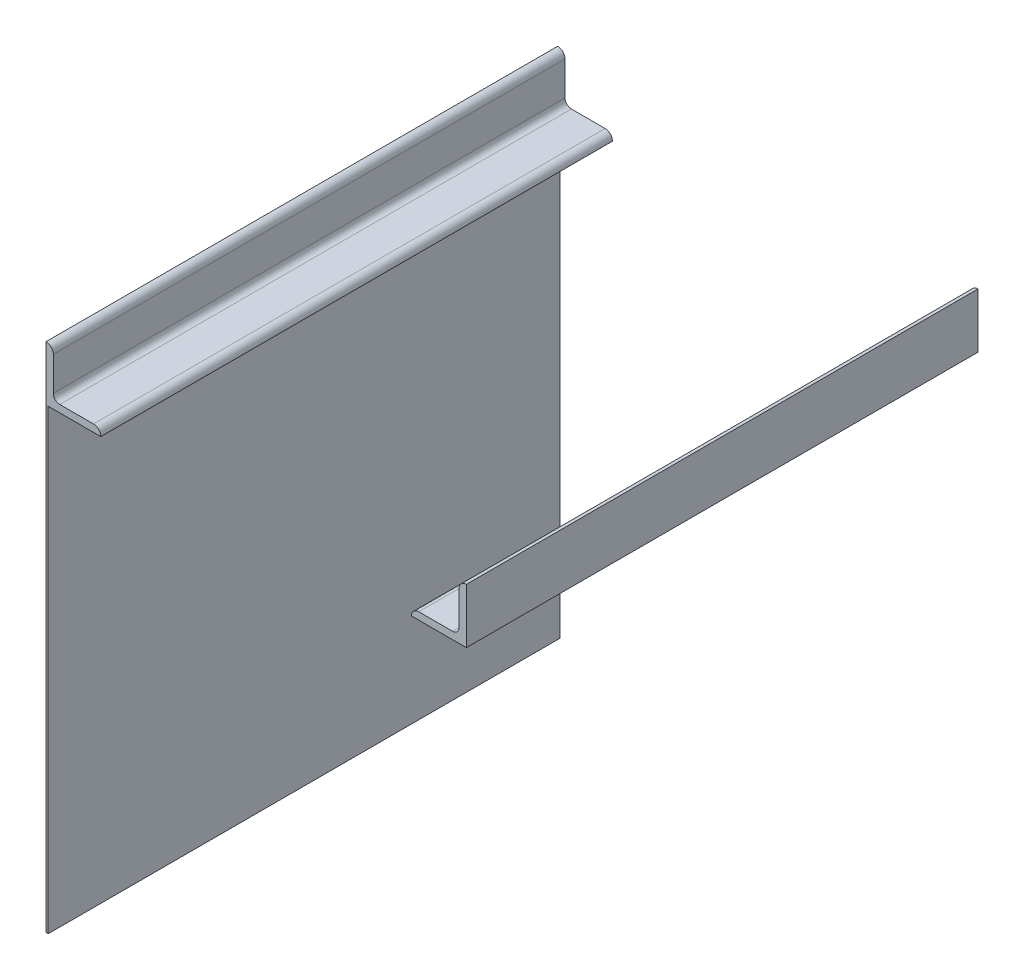
ISO-10303-21;
HEADER;
FILE_DESCRIPTION(('STEP AP214'),'2;1');
FILE_NAME('part.step','',(''),(''),'','','');
FILE_SCHEMA(('AUTOMOTIVE_DESIGN { 1 0 10303 214 1 1 1 1 }'));
ENDSEC;
DATA;
#1=APPLICATION_CONTEXT('core data for automotive mechanical design processes');
#2=APPLICATION_PROTOCOL_DEFINITION('international standard','automotive_design',2000,#1);
#3=PRODUCT_CONTEXT('',#1,'mechanical');
#4=PRODUCT('Part','Part','',(#3));
#5=PRODUCT_RELATED_PRODUCT_CATEGORY('part','',(#4));
#6=PRODUCT_DEFINITION_FORMATION('','',#4);
#7=PRODUCT_DEFINITION_CONTEXT('part definition',#1,'design');
#8=PRODUCT_DEFINITION('design','',#6,#7);
#9=PRODUCT_DEFINITION_SHAPE('','',#8);
#10=(LENGTH_UNIT() NAMED_UNIT(*) SI_UNIT(.MILLI.,.METRE.));
#11=(NAMED_UNIT(*) PLANE_ANGLE_UNIT() SI_UNIT($,.RADIAN.));
#12=(NAMED_UNIT(*) SI_UNIT($,.STERADIAN.) SOLID_ANGLE_UNIT());
#13=UNCERTAINTY_MEASURE_WITH_UNIT(LENGTH_MEASURE(1.E-05),#10,'distance_accuracy_value','');
#14=(GEOMETRIC_REPRESENTATION_CONTEXT(3) GLOBAL_UNCERTAINTY_ASSIGNED_CONTEXT((#13)) GLOBAL_UNIT_ASSIGNED_CONTEXT((#10,
#11,#12)) REPRESENTATION_CONTEXT('',''));
#15=CARTESIAN_POINT('',(0.,0.,0.));
#16=DIRECTION('',(0.,0.,1.));
#17=DIRECTION('',(1.,0.,0.));
#18=AXIS2_PLACEMENT_3D('',#15,#16,#17);
#19=CARTESIAN_POINT('',(0.,-250.,0.));
#20=DIRECTION('',(1.,0.,0.));
#21=DIRECTION('',(0.,0.,-1.));
#22=AXIS2_PLACEMENT_3D('',#19,#20,#21);
#23=PLANE('',#22);
#24=DIRECTION('',(0.,0.,-1.));
#25=VECTOR('',#24,1.);
#26=CARTESIAN_POINT('',(0.,0.,0.));
#27=LINE('',#26,#25);
#28=CARTESIAN_POINT('',(0.,0.,280.));
#29=VERTEX_POINT('',#28);
#30=CARTESIAN_POINT('',(0.,0.,0.));
#31=VERTEX_POINT('',#30);
#32=EDGE_CURVE('E135',#29,#31,#27,.T.);
#33=ORIENTED_EDGE('',*,*,#32,.T.);
#34=DIRECTION('',(0.,1.,0.));
#35=VECTOR('',#34,1.);
#36=CARTESIAN_POINT('',(0.,-250.,0.));
#37=LINE('',#36,#35);
#38=CARTESIAN_POINT('',(0.,-250.,0.));
#39=VERTEX_POINT('',#38);
#40=EDGE_CURVE('E14',#39,#31,#37,.T.);
#41=ORIENTED_EDGE('',*,*,#40,.F.);
#42=DIRECTION('',(0.,0.,-1.));
#43=VECTOR('',#42,1.);
#44=CARTESIAN_POINT('',(0.,-250.,0.));
#45=LINE('',#44,#43);
#46=CARTESIAN_POINT('',(0.,-250.,280.));
#47=VERTEX_POINT('',#46);
#48=EDGE_CURVE('E123',#47,#39,#45,.T.);
#49=ORIENTED_EDGE('',*,*,#48,.F.);
#50=DIRECTION('',(0.,1.,0.));
#51=VECTOR('',#50,1.);
#52=CARTESIAN_POINT('',(0.,-250.,280.));
#53=LINE('',#52,#51);
#54=EDGE_CURVE('E131',#47,#29,#53,.T.);
#55=ORIENTED_EDGE('',*,*,#54,.T.);
#56=EDGE_LOOP('',(#33,#41,#49,#55));
#57=FACE_BOUND('',#56,.T.);
#58=ADVANCED_FACE('F72',(#57),#23,.F.);
#59=CARTESIAN_POINT('',(0.,-250.,0.));
#60=DIRECTION('',(0.,0.,1.));
#61=DIRECTION('',(1.,0.,0.));
#62=AXIS2_PLACEMENT_3D('',#59,#60,#61);
#63=PLANE('',#62);
#64=DIRECTION('',(1.,0.,0.));
#65=VECTOR('',#64,1.);
#66=CARTESIAN_POINT('',(0.,0.,0.));
#67=LINE('',#66,#65);
#68=CARTESIAN_POINT('',(1.2,0.,0.));
#69=VERTEX_POINT('',#68);
#70=EDGE_CURVE('E127',#31,#69,#67,.T.);
#71=ORIENTED_EDGE('',*,*,#70,.T.);
#72=DIRECTION('',(0.,1.,0.));
#73=VECTOR('',#72,1.);
#74=CARTESIAN_POINT('',(1.2,-250.,0.));
#75=LINE('',#74,#73);
#76=CARTESIAN_POINT('',(1.2,-250.,0.));
#77=VERTEX_POINT('',#76);
#78=EDGE_CURVE('E80',#77,#69,#75,.T.);
#79=ORIENTED_EDGE('',*,*,#78,.F.);
#80=DIRECTION('',(1.,0.,0.));
#81=VECTOR('',#80,1.);
#82=CARTESIAN_POINT('',(0.,-250.,0.));
#83=LINE('',#82,#81);
#84=EDGE_CURVE('E118',#39,#77,#83,.T.);
#85=ORIENTED_EDGE('',*,*,#84,.F.);
#86=ORIENTED_EDGE('',*,*,#40,.T.);
#87=EDGE_LOOP('',(#71,#79,#85,#86));
#88=FACE_BOUND('',#87,.T.);
#89=ADVANCED_FACE('F126',(#88),#63,.F.);
#90=CARTESIAN_POINT('',(1.2,-250.,0.));
#91=DIRECTION('',(-1.,0.,0.));
#92=DIRECTION('',(0.,0.,1.));
#93=AXIS2_PLACEMENT_3D('',#90,#91,#92);
#94=PLANE('',#93);
#95=DIRECTION('',(0.,0.,1.));
#96=VECTOR('',#95,1.);
#97=CARTESIAN_POINT('',(1.2,0.,0.));
#98=LINE('',#97,#96);
#99=CARTESIAN_POINT('',(1.2,0.,280.));
#100=VERTEX_POINT('',#99);
#101=EDGE_CURVE('E105',#69,#100,#98,.T.);
#102=ORIENTED_EDGE('',*,*,#101,.T.);
#103=DIRECTION('',(0.,1.,0.));
#104=VECTOR('',#103,1.);
#105=CARTESIAN_POINT('',(1.2,-250.,280.));
#106=LINE('',#105,#104);
#107=CARTESIAN_POINT('',(1.2,-250.,280.));
#108=VERTEX_POINT('',#107);
#109=EDGE_CURVE('E128',#108,#100,#106,.T.);
#110=ORIENTED_EDGE('',*,*,#109,.F.);
#111=DIRECTION('',(0.,0.,1.));
#112=VECTOR('',#111,1.);
#113=CARTESIAN_POINT('',(1.2,-250.,0.));
#114=LINE('',#113,#112);
#115=EDGE_CURVE('E121',#77,#108,#114,.T.);
#116=ORIENTED_EDGE('',*,*,#115,.F.);
#117=ORIENTED_EDGE('',*,*,#78,.T.);
#118=EDGE_LOOP('',(#102,#110,#116,#117));
#119=FACE_BOUND('',#118,.T.);
#120=ADVANCED_FACE('F129',(#119),#94,.F.);
#121=CARTESIAN_POINT('',(0.,-250.,280.));
#122=DIRECTION('',(0.,0.,-1.));
#123=DIRECTION('',(-1.,0.,0.));
#124=AXIS2_PLACEMENT_3D('',#121,#122,#123);
#125=PLANE('',#124);
#126=DIRECTION('',(-1.,0.,0.));
#127=VECTOR('',#126,1.);
#128=CARTESIAN_POINT('',(0.,0.,280.));
#129=LINE('',#128,#127);
#130=EDGE_CURVE('E111',#100,#29,#129,.T.);
#131=ORIENTED_EDGE('',*,*,#130,.T.);
#132=ORIENTED_EDGE('',*,*,#54,.F.);
#133=DIRECTION('',(-1.,0.,0.));
#134=VECTOR('',#133,1.);
#135=CARTESIAN_POINT('',(0.,-250.,280.));
#136=LINE('',#135,#134);
#137=EDGE_CURVE('E88',#108,#47,#136,.T.);
#138=ORIENTED_EDGE('',*,*,#137,.F.);
#139=ORIENTED_EDGE('',*,*,#109,.T.);
#140=EDGE_LOOP('',(#131,#132,#138,#139));
#141=FACE_BOUND('',#140,.T.);
#142=ADVANCED_FACE('F142',(#141),#125,.F.);
#143=CARTESIAN_POINT('',(0.,-250.,0.));
#144=DIRECTION('',(0.,1.,0.));
#145=DIRECTION('',(0.,0.,1.));
#146=AXIS2_PLACEMENT_3D('',#143,#144,#145);
#147=PLANE('',#146);
#148=ORIENTED_EDGE('',*,*,#48,.T.);
#149=ORIENTED_EDGE('',*,*,#84,.T.);
#150=ORIENTED_EDGE('',*,*,#115,.T.);
#151=ORIENTED_EDGE('',*,*,#137,.T.);
#152=EDGE_LOOP('',(#148,#149,#150,#151));
#153=FACE_BOUND('',#152,.T.);
#154=ADVANCED_FACE('F119',(#153),#147,.F.);
#155=CARTESIAN_POINT('',(0.,0.,0.));
#156=DIRECTION('',(0.,1.,0.));
#157=DIRECTION('',(0.,0.,1.));
#158=AXIS2_PLACEMENT_3D('',#155,#156,#157);
#159=PLANE('',#158);
#160=ORIENTED_EDGE('',*,*,#32,.F.);
#161=ORIENTED_EDGE('',*,*,#130,.F.);
#162=ORIENTED_EDGE('',*,*,#101,.F.);
#163=ORIENTED_EDGE('',*,*,#70,.F.);
#164=EDGE_LOOP('',(#160,#161,#162,#163));
#165=FACE_BOUND('',#164,.T.);
#166=ADVANCED_FACE('F145',(#165),#159,.T.);
#167=CLOSED_SHELL('',(#58,#89,#120,#142,#154,#166));
#168=MANIFOLD_SOLID_BREP('B2',#167);
#169=CARTESIAN_POINT('',(230.,30.,280.));
#170=DIRECTION('',(-1.,0.,0.));
#171=DIRECTION('',(0.,-1.,0.));
#172=AXIS2_PLACEMENT_3D('',#169,#170,#171);
#173=PLANE('',#172);
#174=DIRECTION('',(0.,1.,0.));
#175=VECTOR('',#174,1.);
#176=CARTESIAN_POINT('',(230.,30.,0.));
#177=LINE('',#176,#175);
#178=CARTESIAN_POINT('',(230.,0.,0.));
#179=VERTEX_POINT('',#178);
#180=CARTESIAN_POINT('',(230.,30.,0.));
#181=VERTEX_POINT('',#180);
#182=EDGE_CURVE('E295',#179,#181,#177,.T.);
#183=ORIENTED_EDGE('',*,*,#182,.T.);
#184=DIRECTION('',(0.,0.,-1.));
#185=VECTOR('',#184,1.);
#186=CARTESIAN_POINT('',(230.,30.,280.));
#187=LINE('',#186,#185);
#188=CARTESIAN_POINT('',(230.,30.,280.));
#189=VERTEX_POINT('',#188);
#190=EDGE_CURVE('E70',#189,#181,#187,.T.);
#191=ORIENTED_EDGE('',*,*,#190,.F.);
#192=DIRECTION('',(0.,1.,0.));
#193=VECTOR('',#192,1.);
#194=CARTESIAN_POINT('',(230.,30.,280.));
#195=LINE('',#194,#193);
#196=CARTESIAN_POINT('',(230.,0.,280.));
#197=VERTEX_POINT('',#196);
#198=EDGE_CURVE('E307',#197,#189,#195,.T.);
#199=ORIENTED_EDGE('',*,*,#198,.F.);
#200=DIRECTION('',(0.,0.,-1.));
#201=VECTOR('',#200,1.);
#202=CARTESIAN_POINT('',(230.,0.,280.));
#203=LINE('',#202,#201);
#204=EDGE_CURVE('E291',#197,#179,#203,.T.);
#205=ORIENTED_EDGE('',*,*,#204,.T.);
#206=EDGE_LOOP('',(#183,#191,#199,#205));
#207=FACE_BOUND('',#206,.T.);
#208=ADVANCED_FACE('F205',(#207),#173,.F.);
#209=CARTESIAN_POINT('',(230.,26.,280.));
#210=DIRECTION('',(0.,0.,-1.));
#211=DIRECTION('',(-1.,0.,0.));
#212=AXIS2_PLACEMENT_3D('',#209,#210,#211);
#213=CYLINDRICAL_SURFACE('',#212,4.);
#214=CARTESIAN_POINT('',(230.,26.,0.));
#215=DIRECTION('',(0.,0.,1.));
#216=DIRECTION('',(0.,1.,0.));
#217=AXIS2_PLACEMENT_3D('',#214,#215,#216);
#218=CIRCLE('',#217,4.);
#219=CARTESIAN_POINT('',(226.,26.,0.));
#220=VERTEX_POINT('',#219);
#221=EDGE_CURVE('E298',#181,#220,#218,.T.);
#222=ORIENTED_EDGE('',*,*,#221,.T.);
#223=DIRECTION('',(0.,0.,-1.));
#224=VECTOR('',#223,1.);
#225=CARTESIAN_POINT('',(226.,26.,280.));
#226=LINE('',#225,#224);
#227=CARTESIAN_POINT('',(226.,26.,280.));
#228=VERTEX_POINT('',#227);
#229=EDGE_CURVE('E213',#228,#220,#226,.T.);
#230=ORIENTED_EDGE('',*,*,#229,.F.);
#231=CARTESIAN_POINT('',(230.,26.,280.));
#232=DIRECTION('',(0.,0.,1.));
#233=DIRECTION('',(0.,1.,0.));
#234=AXIS2_PLACEMENT_3D('',#231,#232,#233);
#235=CIRCLE('',#234,4.);
#236=EDGE_CURVE('E261',#189,#228,#235,.T.);
#237=ORIENTED_EDGE('',*,*,#236,.F.);
#238=ORIENTED_EDGE('',*,*,#190,.T.);
#239=EDGE_LOOP('',(#222,#230,#237,#238));
#240=FACE_BOUND('',#239,.T.);
#241=ADVANCED_FACE('F332',(#240),#213,.T.);
#242=CARTESIAN_POINT('',(226.,7.49999999999999,280.));
#243=DIRECTION('',(1.,0.,0.));
#244=DIRECTION('',(0.,1.,0.));
#245=AXIS2_PLACEMENT_3D('',#242,#243,#244);
#246=PLANE('',#245);
#247=DIRECTION('',(0.,-1.,0.));
#248=VECTOR('',#247,1.);
#249=CARTESIAN_POINT('',(226.,7.49999999999999,0.));
#250=LINE('',#249,#248);
#251=CARTESIAN_POINT('',(226.,7.49999999999999,0.));
#252=VERTEX_POINT('',#251);
#253=EDGE_CURVE('E300',#220,#252,#250,.T.);
#254=ORIENTED_EDGE('',*,*,#253,.T.);
#255=DIRECTION('',(0.,0.,-1.));
#256=VECTOR('',#255,1.);
#257=CARTESIAN_POINT('',(226.,7.49999999999999,280.));
#258=LINE('',#257,#256);
#259=CARTESIAN_POINT('',(226.,7.49999999999999,280.));
#260=VERTEX_POINT('',#259);
#261=EDGE_CURVE('E311',#260,#252,#258,.T.);
#262=ORIENTED_EDGE('',*,*,#261,.F.);
#263=DIRECTION('',(0.,-1.,0.));
#264=VECTOR('',#263,1.);
#265=CARTESIAN_POINT('',(226.,7.49999999999999,280.));
#266=LINE('',#265,#264);
#267=EDGE_CURVE('E319',#228,#260,#266,.T.);
#268=ORIENTED_EDGE('',*,*,#267,.F.);
#269=ORIENTED_EDGE('',*,*,#229,.T.);
#270=EDGE_LOOP('',(#254,#262,#268,#269));
#271=FACE_BOUND('',#270,.T.);
#272=ADVANCED_FACE('F317',(#271),#246,.F.);
#273=CARTESIAN_POINT('',(222.5,7.49999999999998,280.));
#274=DIRECTION('',(0.,0.,-1.));
#275=DIRECTION('',(-1.,0.,0.));
#276=AXIS2_PLACEMENT_3D('',#273,#274,#275);
#277=CYLINDRICAL_SURFACE('',#276,3.5);
#278=CARTESIAN_POINT('',(222.5,7.49999999999998,0.));
#279=DIRECTION('',(0.,0.,-1.));
#280=DIRECTION('',(0.,-1.,0.));
#281=AXIS2_PLACEMENT_3D('',#278,#279,#280);
#282=CIRCLE('',#281,3.5);
#283=CARTESIAN_POINT('',(222.5,3.99999999999998,0.));
#284=VERTEX_POINT('',#283);
#285=EDGE_CURVE('E302',#252,#284,#282,.T.);
#286=ORIENTED_EDGE('',*,*,#285,.T.);
#287=DIRECTION('',(0.,0.,-1.));
#288=VECTOR('',#287,1.);
#289=CARTESIAN_POINT('',(222.5,3.99999999999998,280.));
#290=LINE('',#289,#288);
#291=CARTESIAN_POINT('',(222.5,3.99999999999998,280.));
#292=VERTEX_POINT('',#291);
#293=EDGE_CURVE('E286',#292,#284,#290,.T.);
#294=ORIENTED_EDGE('',*,*,#293,.F.);
#295=CARTESIAN_POINT('',(222.5,7.49999999999998,280.));
#296=DIRECTION('',(0.,0.,-1.));
#297=DIRECTION('',(0.,-1.,0.));
#298=AXIS2_PLACEMENT_3D('',#295,#296,#297);
#299=CIRCLE('',#298,3.5);
#300=EDGE_CURVE('E277',#260,#292,#299,.T.);
#301=ORIENTED_EDGE('',*,*,#300,.F.);
#302=ORIENTED_EDGE('',*,*,#261,.T.);
#303=EDGE_LOOP('',(#286,#294,#301,#302));
#304=FACE_BOUND('',#303,.T.);
#305=ADVANCED_FACE('F325',(#304),#277,.F.);
#306=CARTESIAN_POINT('',(204.,3.99999999999991,280.));
#307=DIRECTION('',(0.,-1.,0.));
#308=DIRECTION('',(1.,0.,0.));
#309=AXIS2_PLACEMENT_3D('',#306,#307,#308);
#310=PLANE('',#309);
#311=DIRECTION('',(-1.,0.,0.));
#312=VECTOR('',#311,1.);
#313=CARTESIAN_POINT('',(204.,3.9999999999999,0.));
#314=LINE('',#313,#312);
#315=CARTESIAN_POINT('',(204.,3.9999999999999,0.));
#316=VERTEX_POINT('',#315);
#317=EDGE_CURVE('E285',#284,#316,#314,.T.);
#318=ORIENTED_EDGE('',*,*,#317,.T.);
#319=DIRECTION('',(0.,0.,-1.));
#320=VECTOR('',#319,1.);
#321=CARTESIAN_POINT('',(204.,3.99999999999991,280.));
#322=LINE('',#321,#320);
#323=CARTESIAN_POINT('',(204.,3.99999999999991,280.));
#324=VERTEX_POINT('',#323);
#325=EDGE_CURVE('E282',#324,#316,#322,.T.);
#326=ORIENTED_EDGE('',*,*,#325,.F.);
#327=DIRECTION('',(-1.,0.,0.));
#328=VECTOR('',#327,1.);
#329=CARTESIAN_POINT('',(204.,3.99999999999991,280.));
#330=LINE('',#329,#328);
#331=EDGE_CURVE('E271',#292,#324,#330,.T.);
#332=ORIENTED_EDGE('',*,*,#331,.F.);
#333=ORIENTED_EDGE('',*,*,#293,.T.);
#334=EDGE_LOOP('',(#318,#326,#332,#333));
#335=FACE_BOUND('',#334,.T.);
#336=ADVANCED_FACE('F283',(#335),#310,.F.);
#337=CARTESIAN_POINT('',(204.,0.,280.));
#338=DIRECTION('',(0.,0.,-1.));
#339=DIRECTION('',(-1.,0.,0.));
#340=AXIS2_PLACEMENT_3D('',#337,#338,#339);
#341=CYLINDRICAL_SURFACE('',#340,4.);
#342=CARTESIAN_POINT('',(204.,0.,0.));
#343=DIRECTION('',(0.,0.,1.));
#344=DIRECTION('',(0.,-1.,0.));
#345=AXIS2_PLACEMENT_3D('',#342,#343,#344);
#346=CIRCLE('',#345,4.);
#347=CARTESIAN_POINT('',(200.,-1.04083408558608E-13,0.));
#348=VERTEX_POINT('',#347);
#349=EDGE_CURVE('E247',#316,#348,#346,.T.);
#350=ORIENTED_EDGE('',*,*,#349,.T.);
#351=DIRECTION('',(0.,0.,-1.));
#352=VECTOR('',#351,1.);
#353=CARTESIAN_POINT('',(200.,-1.05818132034585E-13,280.));
#354=LINE('',#353,#352);
#355=CARTESIAN_POINT('',(200.,-1.05818132034585E-13,280.));
#356=VERTEX_POINT('',#355);
#357=EDGE_CURVE('E287',#356,#348,#354,.T.);
#358=ORIENTED_EDGE('',*,*,#357,.F.);
#359=CARTESIAN_POINT('',(204.,0.,280.));
#360=DIRECTION('',(0.,0.,1.));
#361=DIRECTION('',(0.,-1.,0.));
#362=AXIS2_PLACEMENT_3D('',#359,#360,#361);
#363=CIRCLE('',#362,4.);
#364=EDGE_CURVE('E275',#324,#356,#363,.T.);
#365=ORIENTED_EDGE('',*,*,#364,.F.);
#366=ORIENTED_EDGE('',*,*,#325,.T.);
#367=EDGE_LOOP('',(#350,#358,#365,#366));
#368=FACE_BOUND('',#367,.T.);
#369=ADVANCED_FACE('F289',(#368),#341,.T.);
#370=CARTESIAN_POINT('',(230.,0.,280.));
#371=DIRECTION('',(0.,1.,0.));
#372=DIRECTION('',(-1.,0.,0.));
#373=AXIS2_PLACEMENT_3D('',#370,#371,#372);
#374=PLANE('',#373);
#375=DIRECTION('',(1.,0.,0.));
#376=VECTOR('',#375,1.);
#377=CARTESIAN_POINT('',(230.,0.,0.));
#378=LINE('',#377,#376);
#379=EDGE_CURVE('E253',#348,#179,#378,.T.);
#380=ORIENTED_EDGE('',*,*,#379,.T.);
#381=ORIENTED_EDGE('',*,*,#204,.F.);
#382=DIRECTION('',(1.,0.,0.));
#383=VECTOR('',#382,1.);
#384=CARTESIAN_POINT('',(230.,0.,280.));
#385=LINE('',#384,#383);
#386=EDGE_CURVE('E221',#356,#197,#385,.T.);
#387=ORIENTED_EDGE('',*,*,#386,.F.);
#388=ORIENTED_EDGE('',*,*,#357,.T.);
#389=EDGE_LOOP('',(#380,#381,#387,#388));
#390=FACE_BOUND('',#389,.T.);
#391=ADVANCED_FACE('F346',(#390),#374,.F.);
#392=CARTESIAN_POINT('',(204.,0.,280.));
#393=DIRECTION('',(0.,0.,-1.));
#394=DIRECTION('',(0.,-1.,0.));
#395=AXIS2_PLACEMENT_3D('',#392,#393,#394);
#396=PLANE('',#395);
#397=ORIENTED_EDGE('',*,*,#198,.T.);
#398=ORIENTED_EDGE('',*,*,#236,.T.);
#399=ORIENTED_EDGE('',*,*,#267,.T.);
#400=ORIENTED_EDGE('',*,*,#300,.T.);
#401=ORIENTED_EDGE('',*,*,#331,.T.);
#402=ORIENTED_EDGE('',*,*,#364,.T.);
#403=ORIENTED_EDGE('',*,*,#386,.T.);
#404=EDGE_LOOP('',(#397,#398,#399,#400,#401,#402,#403));
#405=FACE_BOUND('',#404,.T.);
#406=ADVANCED_FACE('F273',(#405),#396,.F.);
#407=CARTESIAN_POINT('',(204.,0.,0.));
#408=DIRECTION('',(0.,0.,-1.));
#409=DIRECTION('',(0.,-1.,0.));
#410=AXIS2_PLACEMENT_3D('',#407,#408,#409);
#411=PLANE('',#410);
#412=ORIENTED_EDGE('',*,*,#182,.F.);
#413=ORIENTED_EDGE('',*,*,#379,.F.);
#414=ORIENTED_EDGE('',*,*,#349,.F.);
#415=ORIENTED_EDGE('',*,*,#317,.F.);
#416=ORIENTED_EDGE('',*,*,#285,.F.);
#417=ORIENTED_EDGE('',*,*,#253,.F.);
#418=ORIENTED_EDGE('',*,*,#221,.F.);
#419=EDGE_LOOP('',(#412,#413,#414,#415,#416,#417,#418));
#420=FACE_BOUND('',#419,.T.);
#421=ADVANCED_FACE('F323',(#420),#411,.T.);
#422=CLOSED_SHELL('',(#208,#241,#272,#305,#336,#369,#391,#406,#421));
#423=MANIFOLD_SOLID_BREP('B8',#422);
#424=CARTESIAN_POINT('',(30.,0.,280.));
#425=DIRECTION('',(0.,1.,0.));
#426=DIRECTION('',(0.,0.,1.));
#427=AXIS2_PLACEMENT_3D('',#424,#425,#426);
#428=PLANE('',#427);
#429=DIRECTION('',(1.,0.,0.));
#430=VECTOR('',#429,1.);
#431=CARTESIAN_POINT('',(30.,0.,0.));
#432=LINE('',#431,#430);
#433=CARTESIAN_POINT('',(0.,0.,0.));
#434=VERTEX_POINT('',#433);
#435=CARTESIAN_POINT('',(30.,0.,0.));
#436=VERTEX_POINT('',#435);
#437=EDGE_CURVE('E497',#434,#436,#432,.T.);
#438=ORIENTED_EDGE('',*,*,#437,.T.);
#439=DIRECTION('',(0.,0.,-1.));
#440=VECTOR('',#439,1.);
#441=CARTESIAN_POINT('',(30.,0.,280.));
#442=LINE('',#441,#440);
#443=CARTESIAN_POINT('',(30.,0.,280.));
#444=VERTEX_POINT('',#443);
#445=EDGE_CURVE('E203',#444,#436,#442,.T.);
#446=ORIENTED_EDGE('',*,*,#445,.F.);
#447=DIRECTION('',(1.,0.,0.));
#448=VECTOR('',#447,1.);
#449=CARTESIAN_POINT('',(30.,0.,280.));
#450=LINE('',#449,#448);
#451=CARTESIAN_POINT('',(0.,0.,280.));
#452=VERTEX_POINT('',#451);
#453=EDGE_CURVE('E509',#452,#444,#450,.T.);
#454=ORIENTED_EDGE('',*,*,#453,.F.);
#455=DIRECTION('',(0.,0.,-1.));
#456=VECTOR('',#455,1.);
#457=CARTESIAN_POINT('',(0.,0.,280.));
#458=LINE('',#457,#456);
#459=EDGE_CURVE('E493',#452,#434,#458,.T.);
#460=ORIENTED_EDGE('',*,*,#459,.T.);
#461=EDGE_LOOP('',(#438,#446,#454,#460));
#462=FACE_BOUND('',#461,.T.);
#463=ADVANCED_FACE('F407',(#462),#428,.F.);
#464=CARTESIAN_POINT('',(26.,0.,280.));
#465=DIRECTION('',(0.,0.,-1.));
#466=DIRECTION('',(-1.,0.,0.));
#467=AXIS2_PLACEMENT_3D('',#464,#465,#466);
#468=CYLINDRICAL_SURFACE('',#467,4.);
#469=CARTESIAN_POINT('',(26.,0.,0.));
#470=DIRECTION('',(0.,0.,1.));
#471=DIRECTION('',(1.,0.,0.));
#472=AXIS2_PLACEMENT_3D('',#469,#470,#471);
#473=CIRCLE('',#472,4.);
#474=CARTESIAN_POINT('',(26.,4.,0.));
#475=VERTEX_POINT('',#474);
#476=EDGE_CURVE('E500',#436,#475,#473,.T.);
#477=ORIENTED_EDGE('',*,*,#476,.T.);
#478=DIRECTION('',(0.,0.,-1.));
#479=VECTOR('',#478,1.);
#480=CARTESIAN_POINT('',(26.,4.,280.));
#481=LINE('',#480,#479);
#482=CARTESIAN_POINT('',(26.,4.,280.));
#483=VERTEX_POINT('',#482);
#484=EDGE_CURVE('E415',#483,#475,#481,.T.);
#485=ORIENTED_EDGE('',*,*,#484,.F.);
#486=CARTESIAN_POINT('',(26.,0.,280.));
#487=DIRECTION('',(0.,0.,1.));
#488=DIRECTION('',(1.,0.,0.));
#489=AXIS2_PLACEMENT_3D('',#486,#487,#488);
#490=CIRCLE('',#489,4.);
#491=EDGE_CURVE('E463',#444,#483,#490,.T.);
#492=ORIENTED_EDGE('',*,*,#491,.F.);
#493=ORIENTED_EDGE('',*,*,#445,.T.);
#494=EDGE_LOOP('',(#477,#485,#492,#493));
#495=FACE_BOUND('',#494,.T.);
#496=ADVANCED_FACE('F534',(#495),#468,.T.);
#497=CARTESIAN_POINT('',(7.50000000000004,4.,280.));
#498=DIRECTION('',(0.,-1.,0.));
#499=DIRECTION('',(1.,0.,0.));
#500=AXIS2_PLACEMENT_3D('',#497,#498,#499);
#501=PLANE('',#500);
#502=DIRECTION('',(-1.,0.,0.));
#503=VECTOR('',#502,1.);
#504=CARTESIAN_POINT('',(7.5,4.,0.));
#505=LINE('',#504,#503);
#506=CARTESIAN_POINT('',(7.5,4.,0.));
#507=VERTEX_POINT('',#506);
#508=EDGE_CURVE('E502',#475,#507,#505,.T.);
#509=ORIENTED_EDGE('',*,*,#508,.T.);
#510=DIRECTION('',(0.,0.,-1.));
#511=VECTOR('',#510,1.);
#512=CARTESIAN_POINT('',(7.50000000000004,4.,280.));
#513=LINE('',#512,#511);
#514=CARTESIAN_POINT('',(7.50000000000004,4.,280.));
#515=VERTEX_POINT('',#514);
#516=EDGE_CURVE('E513',#515,#507,#513,.T.);
#517=ORIENTED_EDGE('',*,*,#516,.F.);
#518=DIRECTION('',(-1.,0.,0.));
#519=VECTOR('',#518,1.);
#520=CARTESIAN_POINT('',(7.50000000000004,4.,280.));
#521=LINE('',#520,#519);
#522=EDGE_CURVE('E521',#483,#515,#521,.T.);
#523=ORIENTED_EDGE('',*,*,#522,.F.);
#524=ORIENTED_EDGE('',*,*,#484,.T.);
#525=EDGE_LOOP('',(#509,#517,#523,#524));
#526=FACE_BOUND('',#525,.T.);
#527=ADVANCED_FACE('F519',(#526),#501,.F.);
#528=CARTESIAN_POINT('',(7.50000000000004,7.5,280.));
#529=DIRECTION('',(0.,0.,-1.));
#530=DIRECTION('',(-1.,0.,0.));
#531=AXIS2_PLACEMENT_3D('',#528,#529,#530);
#532=CYLINDRICAL_SURFACE('',#531,3.5);
#533=CARTESIAN_POINT('',(7.5,7.5,0.));
#534=DIRECTION('',(0.,0.,-1.));
#535=DIRECTION('',(-1.,0.,0.));
#536=AXIS2_PLACEMENT_3D('',#533,#534,#535);
#537=CIRCLE('',#536,3.5);
#538=CARTESIAN_POINT('',(4.,7.5,0.));
#539=VERTEX_POINT('',#538);
#540=EDGE_CURVE('E504',#507,#539,#537,.T.);
#541=ORIENTED_EDGE('',*,*,#540,.T.);
#542=DIRECTION('',(0.,0.,-1.));
#543=VECTOR('',#542,1.);
#544=CARTESIAN_POINT('',(4.00000000000003,7.5,280.));
#545=LINE('',#544,#543);
#546=CARTESIAN_POINT('',(4.00000000000003,7.5,280.));
#547=VERTEX_POINT('',#546);
#548=EDGE_CURVE('E488',#547,#539,#545,.T.);
#549=ORIENTED_EDGE('',*,*,#548,.F.);
#550=CARTESIAN_POINT('',(7.50000000000004,7.5,280.));
#551=DIRECTION('',(0.,0.,-1.));
#552=DIRECTION('',(-1.,0.,0.));
#553=AXIS2_PLACEMENT_3D('',#550,#551,#552);
#554=CIRCLE('',#553,3.5);
#555=EDGE_CURVE('E479',#515,#547,#554,.T.);
#556=ORIENTED_EDGE('',*,*,#555,.F.);
#557=ORIENTED_EDGE('',*,*,#516,.T.);
#558=EDGE_LOOP('',(#541,#549,#556,#557));
#559=FACE_BOUND('',#558,.T.);
#560=ADVANCED_FACE('F527',(#559),#532,.F.);
#561=CARTESIAN_POINT('',(4.00000000000003,26.,280.));
#562=DIRECTION('',(-1.,0.,0.));
#563=DIRECTION('',(0.,-1.,0.));
#564=AXIS2_PLACEMENT_3D('',#561,#562,#563);
#565=PLANE('',#564);
#566=DIRECTION('',(0.,1.,0.));
#567=VECTOR('',#566,1.);
#568=CARTESIAN_POINT('',(4.,26.,0.));
#569=LINE('',#568,#567);
#570=CARTESIAN_POINT('',(4.,26.,0.));
#571=VERTEX_POINT('',#570);
#572=EDGE_CURVE('E487',#539,#571,#569,.T.);
#573=ORIENTED_EDGE('',*,*,#572,.T.);
#574=DIRECTION('',(0.,0.,-1.));
#575=VECTOR('',#574,1.);
#576=CARTESIAN_POINT('',(4.00000000000003,26.,280.));
#577=LINE('',#576,#575);
#578=CARTESIAN_POINT('',(4.00000000000003,26.,280.));
#579=VERTEX_POINT('',#578);
#580=EDGE_CURVE('E484',#579,#571,#577,.T.);
#581=ORIENTED_EDGE('',*,*,#580,.F.);
#582=DIRECTION('',(0.,1.,0.));
#583=VECTOR('',#582,1.);
#584=CARTESIAN_POINT('',(4.00000000000003,26.,280.));
#585=LINE('',#584,#583);
#586=EDGE_CURVE('E473',#547,#579,#585,.T.);
#587=ORIENTED_EDGE('',*,*,#586,.F.);
#588=ORIENTED_EDGE('',*,*,#548,.T.);
#589=EDGE_LOOP('',(#573,#581,#587,#588));
#590=FACE_BOUND('',#589,.T.);
#591=ADVANCED_FACE('F485',(#590),#565,.F.);
#592=CARTESIAN_POINT('',(0.,26.,280.));
#593=DIRECTION('',(0.,0.,-1.));
#594=DIRECTION('',(-1.,0.,0.));
#595=AXIS2_PLACEMENT_3D('',#592,#593,#594);
#596=CYLINDRICAL_SURFACE('',#595,4.);
#597=CARTESIAN_POINT('',(0.,26.,0.));
#598=DIRECTION('',(0.,0.,1.));
#599=DIRECTION('',(-1.,0.,0.));
#600=AXIS2_PLACEMENT_3D('',#597,#598,#599);
#601=CIRCLE('',#600,4.);
#602=CARTESIAN_POINT('',(0.,30.,0.));
#603=VERTEX_POINT('',#602);
#604=EDGE_CURVE('E449',#571,#603,#601,.T.);
#605=ORIENTED_EDGE('',*,*,#604,.T.);
#606=DIRECTION('',(0.,0.,-1.));
#607=VECTOR('',#606,1.);
#608=CARTESIAN_POINT('',(0.,30.,280.));
#609=LINE('',#608,#607);
#610=CARTESIAN_POINT('',(0.,30.,280.));
#611=VERTEX_POINT('',#610);
#612=EDGE_CURVE('E489',#611,#603,#609,.T.);
#613=ORIENTED_EDGE('',*,*,#612,.F.);
#614=CARTESIAN_POINT('',(0.,26.,280.));
#615=DIRECTION('',(0.,0.,1.));
#616=DIRECTION('',(-1.,0.,0.));
#617=AXIS2_PLACEMENT_3D('',#614,#615,#616);
#618=CIRCLE('',#617,4.);
#619=EDGE_CURVE('E477',#579,#611,#618,.T.);
#620=ORIENTED_EDGE('',*,*,#619,.F.);
#621=ORIENTED_EDGE('',*,*,#580,.T.);
#622=EDGE_LOOP('',(#605,#613,#620,#621));
#623=FACE_BOUND('',#622,.T.);
#624=ADVANCED_FACE('F491',(#623),#596,.T.);
#625=CARTESIAN_POINT('',(0.,0.,280.));
#626=DIRECTION('',(1.,0.,0.));
#627=DIRECTION('',(0.,0.,-1.));
#628=AXIS2_PLACEMENT_3D('',#625,#626,#627);
#629=PLANE('',#628);
#630=DIRECTION('',(0.,-1.,0.));
#631=VECTOR('',#630,1.);
#632=CARTESIAN_POINT('',(0.,0.,0.));
#633=LINE('',#632,#631);
#634=EDGE_CURVE('E455',#603,#434,#633,.T.);
#635=ORIENTED_EDGE('',*,*,#634,.T.);
#636=ORIENTED_EDGE('',*,*,#459,.F.);
#637=DIRECTION('',(0.,-1.,0.));
#638=VECTOR('',#637,1.);
#639=CARTESIAN_POINT('',(0.,0.,280.));
#640=LINE('',#639,#638);
#641=EDGE_CURVE('E423',#611,#452,#640,.T.);
#642=ORIENTED_EDGE('',*,*,#641,.F.);
#643=ORIENTED_EDGE('',*,*,#612,.T.);
#644=EDGE_LOOP('',(#635,#636,#642,#643));
#645=FACE_BOUND('',#644,.T.);
#646=ADVANCED_FACE('F548',(#645),#629,.F.);
#647=CARTESIAN_POINT('',(0.,26.,280.));
#648=DIRECTION('',(0.,0.,-1.));
#649=DIRECTION('',(-1.,0.,0.));
#650=AXIS2_PLACEMENT_3D('',#647,#648,#649);
#651=PLANE('',#650);
#652=ORIENTED_EDGE('',*,*,#453,.T.);
#653=ORIENTED_EDGE('',*,*,#491,.T.);
#654=ORIENTED_EDGE('',*,*,#522,.T.);
#655=ORIENTED_EDGE('',*,*,#555,.T.);
#656=ORIENTED_EDGE('',*,*,#586,.T.);
#657=ORIENTED_EDGE('',*,*,#619,.T.);
#658=ORIENTED_EDGE('',*,*,#641,.T.);
#659=EDGE_LOOP('',(#652,#653,#654,#655,#656,#657,#658));
#660=FACE_BOUND('',#659,.T.);
#661=ADVANCED_FACE('F475',(#660),#651,.F.);
#662=CARTESIAN_POINT('',(0.,26.,0.));
#663=DIRECTION('',(0.,0.,-1.));
#664=DIRECTION('',(-1.,0.,0.));
#665=AXIS2_PLACEMENT_3D('',#662,#663,#664);
#666=PLANE('',#665);
#667=ORIENTED_EDGE('',*,*,#437,.F.);
#668=ORIENTED_EDGE('',*,*,#634,.F.);
#669=ORIENTED_EDGE('',*,*,#604,.F.);
#670=ORIENTED_EDGE('',*,*,#572,.F.);
#671=ORIENTED_EDGE('',*,*,#540,.F.);
#672=ORIENTED_EDGE('',*,*,#508,.F.);
#673=ORIENTED_EDGE('',*,*,#476,.F.);
#674=EDGE_LOOP('',(#667,#668,#669,#670,#671,#672,#673));
#675=FACE_BOUND('',#674,.T.);
#676=ADVANCED_FACE('F525',(#675),#666,.T.);
#677=CLOSED_SHELL('',(#463,#496,#527,#560,#591,#624,#646,#661,#676));
#678=MANIFOLD_SOLID_BREP('B64',#677);
#679=ADVANCED_BREP_SHAPE_REPRESENTATION('',(#18,#168,#423,#678),#14);
#680=SHAPE_DEFINITION_REPRESENTATION(#9,#679);
ENDSEC;
END-ISO-10303-21;
